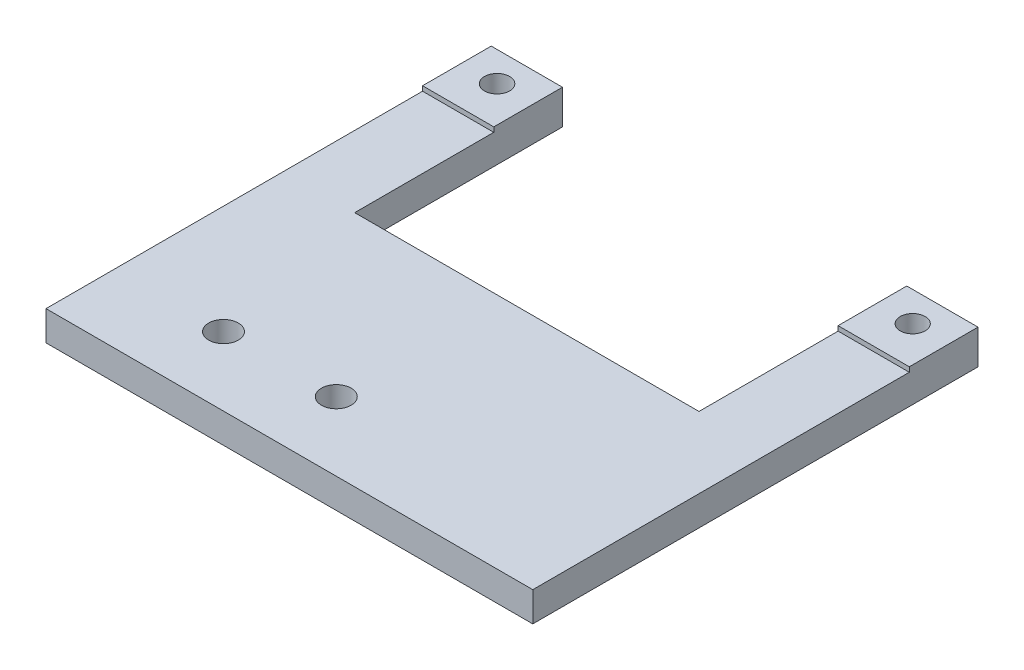
ISO-10303-21;
HEADER;
FILE_DESCRIPTION(('STEP AP214'),'2;1');
FILE_NAME('part.step','',(''),(''),'','','');
FILE_SCHEMA(('AUTOMOTIVE_DESIGN { 1 0 10303 214 1 1 1 1 }'));
ENDSEC;
DATA;
#1=APPLICATION_CONTEXT('core data for automotive mechanical design processes');
#2=APPLICATION_PROTOCOL_DEFINITION('international standard','automotive_design',2000,#1);
#3=PRODUCT_CONTEXT('',#1,'mechanical');
#4=PRODUCT('Part','Part','',(#3));
#5=PRODUCT_RELATED_PRODUCT_CATEGORY('part','',(#4));
#6=PRODUCT_DEFINITION_FORMATION('','',#4);
#7=PRODUCT_DEFINITION_CONTEXT('part definition',#1,'design');
#8=PRODUCT_DEFINITION('design','',#6,#7);
#9=PRODUCT_DEFINITION_SHAPE('','',#8);
#10=(LENGTH_UNIT() NAMED_UNIT(*) SI_UNIT(.MILLI.,.METRE.));
#11=(NAMED_UNIT(*) PLANE_ANGLE_UNIT() SI_UNIT($,.RADIAN.));
#12=(NAMED_UNIT(*) SI_UNIT($,.STERADIAN.) SOLID_ANGLE_UNIT());
#13=UNCERTAINTY_MEASURE_WITH_UNIT(LENGTH_MEASURE(1.E-05),#10,'distance_accuracy_value','');
#14=(GEOMETRIC_REPRESENTATION_CONTEXT(3) GLOBAL_UNCERTAINTY_ASSIGNED_CONTEXT((#13)) GLOBAL_UNIT_ASSIGNED_CONTEXT((#10,
#11,#12)) REPRESENTATION_CONTEXT('',''));
#15=CARTESIAN_POINT('',(0.,0.,0.));
#16=DIRECTION('',(0.,0.,1.));
#17=DIRECTION('',(1.,0.,0.));
#18=AXIS2_PLACEMENT_3D('',#15,#16,#17);
#19=CARTESIAN_POINT('',(0.,2.5,0.));
#20=DIRECTION('',(0.,1.,0.));
#21=DIRECTION('',(0.,0.,1.));
#22=AXIS2_PLACEMENT_3D('',#19,#20,#21);
#23=PLANE('',#22);
#24=CARTESIAN_POINT('',(-25.1315037940264,2.5,60.5175611108941));
#25=DIRECTION('',(0.,1.,0.));
#26=DIRECTION('',(0.,0.,1.));
#27=AXIS2_PLACEMENT_3D('',#24,#25,#26);
#28=CIRCLE('',#27,1.25);
#29=CARTESIAN_POINT('',(-25.1315037940264,2.5,61.7675611108941));
#30=VERTEX_POINT('',#29);
#31=EDGE_CURVE('E185',#30,#30,#28,.T.);
#32=ORIENTED_EDGE('',*,*,#31,.F.);
#33=EDGE_LOOP('',(#32));
#34=FACE_BOUND('',#33,.T.);
#35=CARTESIAN_POINT('',(-34.6315037940264,2.5,60.5175611108941));
#36=DIRECTION('',(0.,1.,0.));
#37=DIRECTION('',(0.,0.,1.));
#38=AXIS2_PLACEMENT_3D('',#35,#36,#37);
#39=CIRCLE('',#38,1.25);
#40=CARTESIAN_POINT('',(-34.6315037940264,2.5,61.7675611108941));
#41=VERTEX_POINT('',#40);
#42=EDGE_CURVE('E178',#41,#41,#39,.T.);
#43=ORIENTED_EDGE('',*,*,#42,.F.);
#44=EDGE_LOOP('',(#43));
#45=FACE_BOUND('',#44,.T.);
#46=DIRECTION('',(0.,0.,1.));
#47=VECTOR('',#46,1.);
#48=CARTESIAN_POINT('',(-2.78150379402638,2.5,0.));
#49=LINE('',#48,#47);
#50=CARTESIAN_POINT('',(-2.78150379402638,2.5,34.6026026348679));
#51=VERTEX_POINT('',#50);
#52=CARTESIAN_POINT('',(-2.78150379402638,2.5,66.3175611108941));
#53=VERTEX_POINT('',#52);
#54=EDGE_CURVE('E199',#51,#53,#49,.T.);
#55=ORIENTED_EDGE('',*,*,#54,.F.);
#56=DIRECTION('',(1.,0.,0.));
#57=VECTOR('',#56,1.);
#58=CARTESIAN_POINT('',(-8.78150379402637,2.5,34.6026026348679));
#59=LINE('',#58,#57);
#60=CARTESIAN_POINT('',(-8.78150379402637,2.5,34.6026026348679));
#61=VERTEX_POINT('',#60);
#62=EDGE_CURVE('E152',#61,#51,#59,.T.);
#63=ORIENTED_EDGE('',*,*,#62,.F.);
#64=DIRECTION('',(0.,0.,-1.));
#65=VECTOR('',#64,1.);
#66=CARTESIAN_POINT('',(-8.78150379402638,2.5,0.));
#67=LINE('',#66,#65);
#68=CARTESIAN_POINT('',(-8.78150379402638,2.5,46.3175611108941));
#69=VERTEX_POINT('',#68);
#70=EDGE_CURVE('E156',#69,#61,#67,.T.);
#71=ORIENTED_EDGE('',*,*,#70,.F.);
#72=DIRECTION('',(-1.,0.,0.));
#73=VECTOR('',#72,1.);
#74=CARTESIAN_POINT('',(0.,2.5,46.3175611108941));
#75=LINE('',#74,#73);
#76=CARTESIAN_POINT('',(-37.7815037940264,2.5,46.3175611108941));
#77=VERTEX_POINT('',#76);
#78=EDGE_CURVE('E190',#69,#77,#75,.T.);
#79=ORIENTED_EDGE('',*,*,#78,.T.);
#80=DIRECTION('',(0.,0.,-1.));
#81=VECTOR('',#80,1.);
#82=CARTESIAN_POINT('',(-37.7815037940264,2.5,0.));
#83=LINE('',#82,#81);
#84=CARTESIAN_POINT('',(-37.7815037940264,2.5,34.6026026348679));
#85=VERTEX_POINT('',#84);
#86=EDGE_CURVE('E98',#77,#85,#83,.T.);
#87=ORIENTED_EDGE('',*,*,#86,.T.);
#88=DIRECTION('',(1.,0.,0.));
#89=VECTOR('',#88,1.);
#90=CARTESIAN_POINT('',(-37.7815037940264,2.5,34.6026026348679));
#91=LINE('',#90,#89);
#92=CARTESIAN_POINT('',(-43.7815037940264,2.5,34.6026026348679));
#93=VERTEX_POINT('',#92);
#94=EDGE_CURVE('E52',#93,#85,#91,.T.);
#95=ORIENTED_EDGE('',*,*,#94,.F.);
#96=DIRECTION('',(0.,0.,1.));
#97=VECTOR('',#96,1.);
#98=CARTESIAN_POINT('',(-43.7815037940264,2.5,0.));
#99=LINE('',#98,#97);
#100=CARTESIAN_POINT('',(-43.7815037940264,2.5,66.3175611108941));
#101=VERTEX_POINT('',#100);
#102=EDGE_CURVE('E194',#93,#101,#99,.T.);
#103=ORIENTED_EDGE('',*,*,#102,.T.);
#104=DIRECTION('',(1.,0.,0.));
#105=VECTOR('',#104,1.);
#106=CARTESIAN_POINT('',(0.,2.5,66.3175611108941));
#107=LINE('',#106,#105);
#108=EDGE_CURVE('E196',#101,#53,#107,.T.);
#109=ORIENTED_EDGE('',*,*,#108,.T.);
#110=EDGE_LOOP('',(#55,#63,#71,#79,#87,#95,#103,#109));
#111=FACE_BOUND('',#110,.T.);
#112=ADVANCED_FACE('F37',(#34,#45,#111),#23,.T.);
#113=CARTESIAN_POINT('',(0.,2.5,46.3175611108941));
#114=DIRECTION('',(0.,0.,1.));
#115=DIRECTION('',(1.,0.,0.));
#116=AXIS2_PLACEMENT_3D('',#113,#114,#115);
#117=PLANE('',#116);
#118=DIRECTION('',(-1.,0.,0.));
#119=VECTOR('',#118,1.);
#120=CARTESIAN_POINT('',(0.,0.,46.3175611108941));
#121=LINE('',#120,#119);
#122=CARTESIAN_POINT('',(-8.78150379402638,0.,46.3175611108941));
#123=VERTEX_POINT('',#122);
#124=CARTESIAN_POINT('',(-37.7815037940264,0.,46.3175611108941));
#125=VERTEX_POINT('',#124);
#126=EDGE_CURVE('E181',#123,#125,#121,.T.);
#127=ORIENTED_EDGE('',*,*,#126,.T.);
#128=DIRECTION('',(0.,-1.,0.));
#129=VECTOR('',#128,1.);
#130=CARTESIAN_POINT('',(-37.7815037940264,2.5,46.3175611108941));
#131=LINE('',#130,#129);
#132=EDGE_CURVE('E11',#77,#125,#131,.T.);
#133=ORIENTED_EDGE('',*,*,#132,.F.);
#134=ORIENTED_EDGE('',*,*,#78,.F.);
#135=DIRECTION('',(0.,-1.,0.));
#136=VECTOR('',#135,1.);
#137=CARTESIAN_POINT('',(-8.78150379402638,2.5,46.3175611108941));
#138=LINE('',#137,#136);
#139=EDGE_CURVE('E61',#69,#123,#138,.T.);
#140=ORIENTED_EDGE('',*,*,#139,.T.);
#141=EDGE_LOOP('',(#127,#133,#134,#140));
#142=FACE_BOUND('',#141,.T.);
#143=ADVANCED_FACE('F39',(#142),#117,.F.);
#144=CARTESIAN_POINT('',(-37.7815037940264,2.5,0.));
#145=DIRECTION('',(-1.,0.,0.));
#146=DIRECTION('',(0.,0.,1.));
#147=AXIS2_PLACEMENT_3D('',#144,#145,#146);
#148=PLANE('',#147);
#149=DIRECTION('',(0.,0.,-1.));
#150=VECTOR('',#149,1.);
#151=CARTESIAN_POINT('',(-37.7815037940264,0.,0.));
#152=LINE('',#151,#150);
#153=CARTESIAN_POINT('',(-37.7815037940264,0.,28.8175611108941));
#154=VERTEX_POINT('',#153);
#155=EDGE_CURVE('E203',#125,#154,#152,.T.);
#156=ORIENTED_EDGE('',*,*,#155,.T.);
#157=DIRECTION('',(0.,-1.,0.));
#158=VECTOR('',#157,1.);
#159=CARTESIAN_POINT('',(-37.7815037940264,2.5,28.8175611108941));
#160=LINE('',#159,#158);
#161=CARTESIAN_POINT('',(-37.7815037940264,2.9,28.8175611108941));
#162=VERTEX_POINT('',#161);
#163=EDGE_CURVE('E45',#162,#154,#160,.T.);
#164=ORIENTED_EDGE('',*,*,#163,.F.);
#165=DIRECTION('',(0.,0.,-1.));
#166=VECTOR('',#165,1.);
#167=CARTESIAN_POINT('',(-37.7815037940264,2.9,28.8175611108941));
#168=LINE('',#167,#166);
#169=CARTESIAN_POINT('',(-37.7815037940264,2.9,34.6026026348679));
#170=VERTEX_POINT('',#169);
#171=EDGE_CURVE('E158',#170,#162,#168,.T.);
#172=ORIENTED_EDGE('',*,*,#171,.F.);
#173=DIRECTION('',(0.,-1.,0.));
#174=VECTOR('',#173,1.);
#175=CARTESIAN_POINT('',(-37.7815037940264,2.9,34.6026026348679));
#176=LINE('',#175,#174);
#177=EDGE_CURVE('E171',#170,#85,#176,.T.);
#178=ORIENTED_EDGE('',*,*,#177,.T.);
#179=ORIENTED_EDGE('',*,*,#86,.F.);
#180=ORIENTED_EDGE('',*,*,#132,.T.);
#181=EDGE_LOOP('',(#156,#164,#172,#178,#179,#180));
#182=FACE_BOUND('',#181,.T.);
#183=ADVANCED_FACE('F262',(#182),#148,.F.);
#184=CARTESIAN_POINT('',(0.,2.5,28.8175611108941));
#185=DIRECTION('',(0.,0.,1.));
#186=DIRECTION('',(1.,0.,0.));
#187=AXIS2_PLACEMENT_3D('',#184,#185,#186);
#188=PLANE('',#187);
#189=DIRECTION('',(-1.,0.,0.));
#190=VECTOR('',#189,1.);
#191=CARTESIAN_POINT('',(0.,0.,28.8175611108941));
#192=LINE('',#191,#190);
#193=CARTESIAN_POINT('',(-43.7815037940264,0.,28.8175611108941));
#194=VERTEX_POINT('',#193);
#195=EDGE_CURVE('E205',#154,#194,#192,.T.);
#196=ORIENTED_EDGE('',*,*,#195,.T.);
#197=DIRECTION('',(0.,-1.,0.));
#198=VECTOR('',#197,1.);
#199=CARTESIAN_POINT('',(-43.7815037940264,2.5,28.8175611108941));
#200=LINE('',#199,#198);
#201=CARTESIAN_POINT('',(-43.7815037940264,2.9,28.8175611108941));
#202=VERTEX_POINT('',#201);
#203=EDGE_CURVE('E233',#202,#194,#200,.T.);
#204=ORIENTED_EDGE('',*,*,#203,.F.);
#205=DIRECTION('',(-1.,0.,0.));
#206=VECTOR('',#205,1.);
#207=CARTESIAN_POINT('',(-37.7815037940264,2.9,28.8175611108941));
#208=LINE('',#207,#206);
#209=EDGE_CURVE('E165',#162,#202,#208,.T.);
#210=ORIENTED_EDGE('',*,*,#209,.F.);
#211=ORIENTED_EDGE('',*,*,#163,.T.);
#212=EDGE_LOOP('',(#196,#204,#210,#211));
#213=FACE_BOUND('',#212,.T.);
#214=ADVANCED_FACE('F239',(#213),#188,.F.);
#215=CARTESIAN_POINT('',(-43.7815037940264,2.5,0.));
#216=DIRECTION('',(1.,0.,0.));
#217=DIRECTION('',(0.,0.,-1.));
#218=AXIS2_PLACEMENT_3D('',#215,#216,#217);
#219=PLANE('',#218);
#220=DIRECTION('',(0.,0.,1.));
#221=VECTOR('',#220,1.);
#222=CARTESIAN_POINT('',(-43.7815037940264,0.,0.));
#223=LINE('',#222,#221);
#224=CARTESIAN_POINT('',(-43.7815037940264,0.,66.3175611108941));
#225=VERTEX_POINT('',#224);
#226=EDGE_CURVE('E207',#194,#225,#223,.T.);
#227=ORIENTED_EDGE('',*,*,#226,.T.);
#228=DIRECTION('',(0.,-1.,0.));
#229=VECTOR('',#228,1.);
#230=CARTESIAN_POINT('',(-43.7815037940264,2.5,66.3175611108941));
#231=LINE('',#230,#229);
#232=EDGE_CURVE('E230',#101,#225,#231,.T.);
#233=ORIENTED_EDGE('',*,*,#232,.F.);
#234=ORIENTED_EDGE('',*,*,#102,.F.);
#235=DIRECTION('',(0.,-1.,0.));
#236=VECTOR('',#235,1.);
#237=CARTESIAN_POINT('',(-43.7815037940264,2.9,34.6026026348679));
#238=LINE('',#237,#236);
#239=CARTESIAN_POINT('',(-43.7815037940264,2.9,34.6026026348679));
#240=VERTEX_POINT('',#239);
#241=EDGE_CURVE('E174',#240,#93,#238,.T.);
#242=ORIENTED_EDGE('',*,*,#241,.F.);
#243=DIRECTION('',(0.,0.,1.));
#244=VECTOR('',#243,1.);
#245=CARTESIAN_POINT('',(-43.7815037940264,2.9,28.8175611108941));
#246=LINE('',#245,#244);
#247=EDGE_CURVE('E168',#202,#240,#246,.T.);
#248=ORIENTED_EDGE('',*,*,#247,.F.);
#249=ORIENTED_EDGE('',*,*,#203,.T.);
#250=EDGE_LOOP('',(#227,#233,#234,#242,#248,#249));
#251=FACE_BOUND('',#250,.T.);
#252=ADVANCED_FACE('F248',(#251),#219,.F.);
#253=CARTESIAN_POINT('',(0.,2.5,66.3175611108941));
#254=DIRECTION('',(0.,0.,-1.));
#255=DIRECTION('',(-1.,0.,0.));
#256=AXIS2_PLACEMENT_3D('',#253,#254,#255);
#257=PLANE('',#256);
#258=DIRECTION('',(1.,0.,0.));
#259=VECTOR('',#258,1.);
#260=CARTESIAN_POINT('',(0.,0.,66.3175611108941));
#261=LINE('',#260,#259);
#262=CARTESIAN_POINT('',(-2.78150379402638,0.,66.3175611108941));
#263=VERTEX_POINT('',#262);
#264=EDGE_CURVE('E209',#225,#263,#261,.T.);
#265=ORIENTED_EDGE('',*,*,#264,.T.);
#266=DIRECTION('',(0.,-1.,0.));
#267=VECTOR('',#266,1.);
#268=CARTESIAN_POINT('',(-2.78150379402638,2.5,66.3175611108941));
#269=LINE('',#268,#267);
#270=EDGE_CURVE('E228',#53,#263,#269,.T.);
#271=ORIENTED_EDGE('',*,*,#270,.F.);
#272=ORIENTED_EDGE('',*,*,#108,.F.);
#273=ORIENTED_EDGE('',*,*,#232,.T.);
#274=EDGE_LOOP('',(#265,#271,#272,#273));
#275=FACE_BOUND('',#274,.T.);
#276=ADVANCED_FACE('F252',(#275),#257,.F.);
#277=CARTESIAN_POINT('',(-2.78150379402638,2.5,0.));
#278=DIRECTION('',(1.,0.,0.));
#279=DIRECTION('',(0.,0.,-1.));
#280=AXIS2_PLACEMENT_3D('',#277,#278,#279);
#281=PLANE('',#280);
#282=DIRECTION('',(0.,0.,1.));
#283=VECTOR('',#282,1.);
#284=CARTESIAN_POINT('',(-2.78150379402638,0.,0.));
#285=LINE('',#284,#283);
#286=CARTESIAN_POINT('',(-2.78150379402638,0.,28.8175611108941));
#287=VERTEX_POINT('',#286);
#288=EDGE_CURVE('E212',#287,#263,#285,.T.);
#289=ORIENTED_EDGE('',*,*,#288,.F.);
#290=DIRECTION('',(0.,-1.,0.));
#291=VECTOR('',#290,1.);
#292=CARTESIAN_POINT('',(-2.78150379402638,2.5,28.8175611108941));
#293=LINE('',#292,#291);
#294=CARTESIAN_POINT('',(-2.78150379402638,2.9,28.8175611108941));
#295=VERTEX_POINT('',#294);
#296=EDGE_CURVE('E226',#295,#287,#293,.T.);
#297=ORIENTED_EDGE('',*,*,#296,.F.);
#298=DIRECTION('',(0.,0.,-1.));
#299=VECTOR('',#298,1.);
#300=CARTESIAN_POINT('',(-2.78150379402638,2.9,28.8175611108941));
#301=LINE('',#300,#299);
#302=CARTESIAN_POINT('',(-2.78150379402638,2.9,34.6026026348679));
#303=VERTEX_POINT('',#302);
#304=EDGE_CURVE('E144',#303,#295,#301,.T.);
#305=ORIENTED_EDGE('',*,*,#304,.F.);
#306=DIRECTION('',(0.,-1.,0.));
#307=VECTOR('',#306,1.);
#308=CARTESIAN_POINT('',(-2.78150379402638,2.9,34.6026026348679));
#309=LINE('',#308,#307);
#310=EDGE_CURVE('E140',#303,#51,#309,.T.);
#311=ORIENTED_EDGE('',*,*,#310,.T.);
#312=ORIENTED_EDGE('',*,*,#54,.T.);
#313=ORIENTED_EDGE('',*,*,#270,.T.);
#314=EDGE_LOOP('',(#289,#297,#305,#311,#312,#313));
#315=FACE_BOUND('',#314,.T.);
#316=ADVANCED_FACE('F292',(#315),#281,.T.);
#317=CARTESIAN_POINT('',(0.,2.5,28.8175611108941));
#318=DIRECTION('',(0.,0.,-1.));
#319=DIRECTION('',(-1.,0.,0.));
#320=AXIS2_PLACEMENT_3D('',#317,#318,#319);
#321=PLANE('',#320);
#322=DIRECTION('',(1.,0.,0.));
#323=VECTOR('',#322,1.);
#324=CARTESIAN_POINT('',(0.,0.,28.8175611108941));
#325=LINE('',#324,#323);
#326=CARTESIAN_POINT('',(-8.78150379402638,0.,28.8175611108941));
#327=VERTEX_POINT('',#326);
#328=EDGE_CURVE('E215',#327,#287,#325,.T.);
#329=ORIENTED_EDGE('',*,*,#328,.F.);
#330=DIRECTION('',(0.,-1.,0.));
#331=VECTOR('',#330,1.);
#332=CARTESIAN_POINT('',(-8.78150379402638,2.5,28.8175611108941));
#333=LINE('',#332,#331);
#334=CARTESIAN_POINT('',(-8.78150379402637,2.9,28.8175611108941));
#335=VERTEX_POINT('',#334);
#336=EDGE_CURVE('E224',#335,#327,#333,.T.);
#337=ORIENTED_EDGE('',*,*,#336,.F.);
#338=DIRECTION('',(-1.,0.,0.));
#339=VECTOR('',#338,1.);
#340=CARTESIAN_POINT('',(-8.78150379402637,2.9,28.8175611108941));
#341=LINE('',#340,#339);
#342=EDGE_CURVE('E151',#295,#335,#341,.T.);
#343=ORIENTED_EDGE('',*,*,#342,.F.);
#344=ORIENTED_EDGE('',*,*,#296,.T.);
#345=EDGE_LOOP('',(#329,#337,#343,#344));
#346=FACE_BOUND('',#345,.T.);
#347=ADVANCED_FACE('F289',(#346),#321,.T.);
#348=CARTESIAN_POINT('',(-8.78150379402638,2.5,0.));
#349=DIRECTION('',(-1.,0.,0.));
#350=DIRECTION('',(0.,0.,1.));
#351=AXIS2_PLACEMENT_3D('',#348,#349,#350);
#352=PLANE('',#351);
#353=DIRECTION('',(0.,0.,-1.));
#354=VECTOR('',#353,1.);
#355=CARTESIAN_POINT('',(-8.78150379402638,0.,0.));
#356=LINE('',#355,#354);
#357=EDGE_CURVE('E218',#123,#327,#356,.T.);
#358=ORIENTED_EDGE('',*,*,#357,.F.);
#359=ORIENTED_EDGE('',*,*,#139,.F.);
#360=ORIENTED_EDGE('',*,*,#70,.T.);
#361=DIRECTION('',(0.,-1.,0.));
#362=VECTOR('',#361,1.);
#363=CARTESIAN_POINT('',(-8.78150379402637,2.9,34.6026026348679));
#364=LINE('',#363,#362);
#365=CARTESIAN_POINT('',(-8.78150379402637,2.9,34.6026026348679));
#366=VERTEX_POINT('',#365);
#367=EDGE_CURVE('E137',#366,#61,#364,.T.);
#368=ORIENTED_EDGE('',*,*,#367,.F.);
#369=DIRECTION('',(0.,0.,1.));
#370=VECTOR('',#369,1.);
#371=CARTESIAN_POINT('',(-8.78150379402637,2.9,28.8175611108941));
#372=LINE('',#371,#370);
#373=EDGE_CURVE('E145',#335,#366,#372,.T.);
#374=ORIENTED_EDGE('',*,*,#373,.F.);
#375=ORIENTED_EDGE('',*,*,#336,.T.);
#376=EDGE_LOOP('',(#358,#359,#360,#368,#374,#375));
#377=FACE_BOUND('',#376,.T.);
#378=ADVANCED_FACE('F154',(#377),#352,.T.);
#379=CARTESIAN_POINT('',(-5.78150379402638,2.5,31.3175611108941));
#380=DIRECTION('',(0.,-1.,0.));
#381=DIRECTION('',(0.,0.,-1.));
#382=AXIS2_PLACEMENT_3D('',#379,#380,#381);
#383=CYLINDRICAL_SURFACE('',#382,1.05);
#384=CARTESIAN_POINT('',(-5.78150379402638,0.,31.3175611108941));
#385=DIRECTION('',(0.,1.,0.));
#386=DIRECTION('',(0.,0.,1.));
#387=AXIS2_PLACEMENT_3D('',#384,#385,#386);
#388=CIRCLE('',#387,1.05);
#389=CARTESIAN_POINT('',(-5.78150379402638,0.,32.3675611108941));
#390=VERTEX_POINT('',#389);
#391=EDGE_CURVE('E192',#390,#390,#388,.T.);
#392=ORIENTED_EDGE('',*,*,#391,.F.);
#393=EDGE_LOOP('',(#392));
#394=FACE_BOUND('',#393,.T.);
#395=CARTESIAN_POINT('',(-5.78150379402638,2.9,31.3175611108941));
#396=DIRECTION('',(0.,-1.,0.));
#397=DIRECTION('',(0.,0.,-1.));
#398=AXIS2_PLACEMENT_3D('',#395,#396,#397);
#399=CIRCLE('',#398,1.05);
#400=CARTESIAN_POINT('',(-5.78150379402638,2.9,30.2675611108941));
#401=VERTEX_POINT('',#400);
#402=EDGE_CURVE('E458',#401,#401,#399,.T.);
#403=ORIENTED_EDGE('',*,*,#402,.F.);
#404=EDGE_LOOP('',(#403));
#405=FACE_BOUND('',#404,.T.);
#406=ADVANCED_FACE('F282',(#394,#405),#383,.F.);
#407=CARTESIAN_POINT('',(0.,0.,0.));
#408=DIRECTION('',(0.,1.,0.));
#409=DIRECTION('',(0.,0.,1.));
#410=AXIS2_PLACEMENT_3D('',#407,#408,#409);
#411=PLANE('',#410);
#412=CARTESIAN_POINT('',(-40.7913212122821,0.,31.3175611108941));
#413=DIRECTION('',(0.,-1.,0.));
#414=DIRECTION('',(0.,0.,-1.));
#415=AXIS2_PLACEMENT_3D('',#412,#413,#414);
#416=CIRCLE('',#415,1.05981741825634);
#417=CARTESIAN_POINT('',(-40.7913212122821,0.,30.2577436926378));
#418=VERTEX_POINT('',#417);
#419=EDGE_CURVE('E453',#418,#418,#416,.T.);
#420=ORIENTED_EDGE('',*,*,#419,.F.);
#421=EDGE_LOOP('',(#420));
#422=FACE_BOUND('',#421,.T.);
#423=CARTESIAN_POINT('',(-34.6315037940264,0.,60.5175611108941));
#424=DIRECTION('',(0.,1.,0.));
#425=DIRECTION('',(0.,0.,1.));
#426=AXIS2_PLACEMENT_3D('',#423,#424,#425);
#427=CIRCLE('',#426,1.25);
#428=CARTESIAN_POINT('',(-34.6315037940264,0.,61.7675611108941));
#429=VERTEX_POINT('',#428);
#430=EDGE_CURVE('E182',#429,#429,#427,.T.);
#431=ORIENTED_EDGE('',*,*,#430,.T.);
#432=EDGE_LOOP('',(#431));
#433=FACE_BOUND('',#432,.T.);
#434=CARTESIAN_POINT('',(-25.1315037940264,0.,60.5175611108941));
#435=DIRECTION('',(0.,1.,0.));
#436=DIRECTION('',(0.,0.,1.));
#437=AXIS2_PLACEMENT_3D('',#434,#435,#436);
#438=CIRCLE('',#437,1.25);
#439=CARTESIAN_POINT('',(-25.1315037940264,0.,61.7675611108941));
#440=VERTEX_POINT('',#439);
#441=EDGE_CURVE('E177',#440,#440,#438,.T.);
#442=ORIENTED_EDGE('',*,*,#441,.T.);
#443=EDGE_LOOP('',(#442));
#444=FACE_BOUND('',#443,.T.);
#445=ORIENTED_EDGE('',*,*,#126,.F.);
#446=ORIENTED_EDGE('',*,*,#357,.T.);
#447=ORIENTED_EDGE('',*,*,#328,.T.);
#448=ORIENTED_EDGE('',*,*,#288,.T.);
#449=ORIENTED_EDGE('',*,*,#264,.F.);
#450=ORIENTED_EDGE('',*,*,#226,.F.);
#451=ORIENTED_EDGE('',*,*,#195,.F.);
#452=ORIENTED_EDGE('',*,*,#155,.F.);
#453=EDGE_LOOP('',(#445,#446,#447,#448,#449,#450,#451,#452));
#454=FACE_BOUND('',#453,.T.);
#455=ORIENTED_EDGE('',*,*,#391,.T.);
#456=EDGE_LOOP('',(#455));
#457=FACE_BOUND('',#456,.T.);
#458=ADVANCED_FACE('F243',(#422,#433,#444,#454,#457),#411,.F.);
#459=CARTESIAN_POINT('',(-25.1315037940264,2.5,60.5175611108941));
#460=DIRECTION('',(0.,-1.,0.));
#461=DIRECTION('',(0.,0.,-1.));
#462=AXIS2_PLACEMENT_3D('',#459,#460,#461);
#463=CYLINDRICAL_SURFACE('',#462,1.25);
#464=ORIENTED_EDGE('',*,*,#31,.T.);
#465=EDGE_LOOP('',(#464));
#466=FACE_BOUND('',#465,.T.);
#467=ORIENTED_EDGE('',*,*,#441,.F.);
#468=EDGE_LOOP('',(#467));
#469=FACE_BOUND('',#468,.T.);
#470=ADVANCED_FACE('F278',(#466,#469),#463,.F.);
#471=CARTESIAN_POINT('',(-34.6315037940264,2.5,60.5175611108941));
#472=DIRECTION('',(0.,-1.,0.));
#473=DIRECTION('',(0.,0.,-1.));
#474=AXIS2_PLACEMENT_3D('',#471,#472,#473);
#475=CYLINDRICAL_SURFACE('',#474,1.25);
#476=ORIENTED_EDGE('',*,*,#42,.T.);
#477=EDGE_LOOP('',(#476));
#478=FACE_BOUND('',#477,.T.);
#479=ORIENTED_EDGE('',*,*,#430,.F.);
#480=EDGE_LOOP('',(#479));
#481=FACE_BOUND('',#480,.T.);
#482=ADVANCED_FACE('F338',(#478,#481),#475,.F.);
#483=CARTESIAN_POINT('',(0.,2.9,0.));
#484=DIRECTION('',(0.,-1.,0.));
#485=DIRECTION('',(0.,0.,-1.));
#486=AXIS2_PLACEMENT_3D('',#483,#484,#485);
#487=PLANE('',#486);
#488=CARTESIAN_POINT('',(-40.7913212122821,2.9,31.3175611108941));
#489=DIRECTION('',(0.,-1.,0.));
#490=DIRECTION('',(0.,0.,-1.));
#491=AXIS2_PLACEMENT_3D('',#488,#489,#490);
#492=CIRCLE('',#491,1.05981741825634);
#493=CARTESIAN_POINT('',(-40.7913212122821,2.9,30.2577436926378));
#494=VERTEX_POINT('',#493);
#495=EDGE_CURVE('E456',#494,#494,#492,.T.);
#496=ORIENTED_EDGE('',*,*,#495,.T.);
#497=EDGE_LOOP('',(#496));
#498=FACE_BOUND('',#497,.T.);
#499=ORIENTED_EDGE('',*,*,#171,.T.);
#500=ORIENTED_EDGE('',*,*,#209,.T.);
#501=ORIENTED_EDGE('',*,*,#247,.T.);
#502=DIRECTION('',(1.,0.,0.));
#503=VECTOR('',#502,1.);
#504=CARTESIAN_POINT('',(-37.7815037940264,2.9,34.6026026348679));
#505=LINE('',#504,#503);
#506=EDGE_CURVE('E170',#240,#170,#505,.T.);
#507=ORIENTED_EDGE('',*,*,#506,.T.);
#508=EDGE_LOOP('',(#499,#500,#501,#507));
#509=FACE_BOUND('',#508,.T.);
#510=ADVANCED_FACE('F261',(#498,#509),#487,.F.);
#511=CARTESIAN_POINT('',(-37.7815037940264,2.9,34.6026026348679));
#512=DIRECTION('',(0.,0.,-1.));
#513=DIRECTION('',(-1.,0.,0.));
#514=AXIS2_PLACEMENT_3D('',#511,#512,#513);
#515=PLANE('',#514);
#516=ORIENTED_EDGE('',*,*,#94,.T.);
#517=ORIENTED_EDGE('',*,*,#177,.F.);
#518=ORIENTED_EDGE('',*,*,#506,.F.);
#519=ORIENTED_EDGE('',*,*,#241,.T.);
#520=EDGE_LOOP('',(#516,#517,#518,#519));
#521=FACE_BOUND('',#520,.T.);
#522=ADVANCED_FACE('F258',(#521),#515,.F.);
#523=CARTESIAN_POINT('',(0.,2.9,0.));
#524=DIRECTION('',(0.,1.,0.));
#525=DIRECTION('',(0.,0.,1.));
#526=AXIS2_PLACEMENT_3D('',#523,#524,#525);
#527=PLANE('',#526);
#528=ORIENTED_EDGE('',*,*,#402,.T.);
#529=EDGE_LOOP('',(#528));
#530=FACE_BOUND('',#529,.T.);
#531=ORIENTED_EDGE('',*,*,#373,.T.);
#532=DIRECTION('',(1.,0.,0.));
#533=VECTOR('',#532,1.);
#534=CARTESIAN_POINT('',(-8.78150379402637,2.9,34.6026026348679));
#535=LINE('',#534,#533);
#536=EDGE_CURVE('E133',#366,#303,#535,.T.);
#537=ORIENTED_EDGE('',*,*,#536,.T.);
#538=ORIENTED_EDGE('',*,*,#304,.T.);
#539=ORIENTED_EDGE('',*,*,#342,.T.);
#540=EDGE_LOOP('',(#531,#537,#538,#539));
#541=FACE_BOUND('',#540,.T.);
#542=ADVANCED_FACE('F149',(#530,#541),#527,.T.);
#543=CARTESIAN_POINT('',(-8.78150379402637,2.9,34.6026026348679));
#544=DIRECTION('',(0.,0.,-1.));
#545=DIRECTION('',(-1.,0.,0.));
#546=AXIS2_PLACEMENT_3D('',#543,#544,#545);
#547=PLANE('',#546);
#548=ORIENTED_EDGE('',*,*,#62,.T.);
#549=ORIENTED_EDGE('',*,*,#310,.F.);
#550=ORIENTED_EDGE('',*,*,#536,.F.);
#551=ORIENTED_EDGE('',*,*,#367,.T.);
#552=EDGE_LOOP('',(#548,#549,#550,#551));
#553=FACE_BOUND('',#552,.T.);
#554=ADVANCED_FACE('F135',(#553),#547,.F.);
#555=CARTESIAN_POINT('',(-40.7913212122821,2.9,31.3175611108941));
#556=DIRECTION('',(0.,-1.,0.));
#557=DIRECTION('',(0.,0.,-1.));
#558=AXIS2_PLACEMENT_3D('',#555,#556,#557);
#559=CYLINDRICAL_SURFACE('',#558,1.05981741825634);
#560=ORIENTED_EDGE('',*,*,#419,.T.);
#561=EDGE_LOOP('',(#560));
#562=FACE_BOUND('',#561,.T.);
#563=ORIENTED_EDGE('',*,*,#495,.F.);
#564=EDGE_LOOP('',(#563));
#565=FACE_BOUND('',#564,.T.);
#566=ADVANCED_FACE('F369',(#562,#565),#559,.F.);
#567=CLOSED_SHELL('',(#112,#143,#183,#214,#252,#276,#316,#347,#378,#406,#458,#470,#482,#510,
#522,#542,#554,#566));
#568=MANIFOLD_SOLID_BREP('B2',#567);
#569=ADVANCED_BREP_SHAPE_REPRESENTATION('',(#18,#568),#14);
#570=SHAPE_DEFINITION_REPRESENTATION(#9,#569);
ENDSEC;
END-ISO-10303-21;
